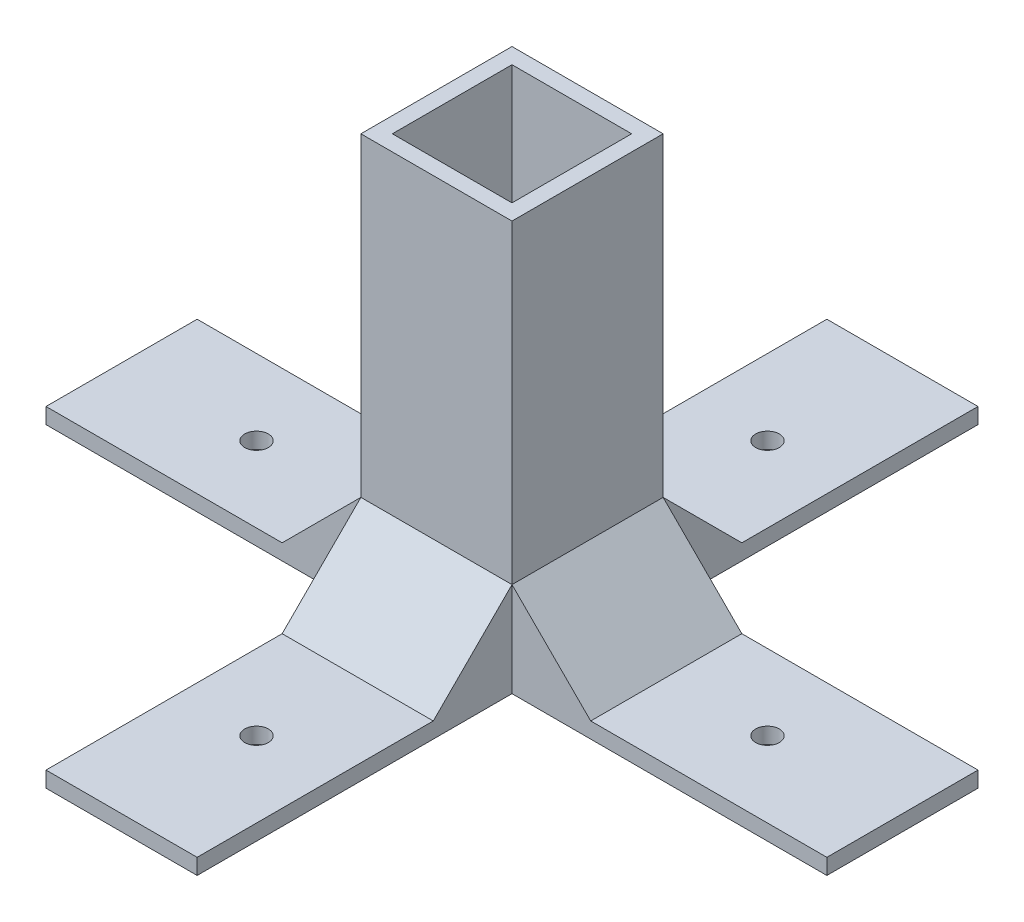
ISO-10303-21;
HEADER;
FILE_DESCRIPTION(('STEP AP214'),'2;1');
FILE_NAME('part.step','',(''),(''),'','','');
FILE_SCHEMA(('AUTOMOTIVE_DESIGN { 1 0 10303 214 1 1 1 1 }'));
ENDSEC;
DATA;
#1=APPLICATION_CONTEXT('core data for automotive mechanical design processes');
#2=APPLICATION_PROTOCOL_DEFINITION('international standard','automotive_design',2000,#1);
#3=PRODUCT_CONTEXT('',#1,'mechanical');
#4=PRODUCT('Part','Part','',(#3));
#5=PRODUCT_RELATED_PRODUCT_CATEGORY('part','',(#4));
#6=PRODUCT_DEFINITION_FORMATION('','',#4);
#7=PRODUCT_DEFINITION_CONTEXT('part definition',#1,'design');
#8=PRODUCT_DEFINITION('design','',#6,#7);
#9=PRODUCT_DEFINITION_SHAPE('','',#8);
#10=(LENGTH_UNIT() NAMED_UNIT(*) SI_UNIT(.MILLI.,.METRE.));
#11=(NAMED_UNIT(*) PLANE_ANGLE_UNIT() SI_UNIT($,.RADIAN.));
#12=(NAMED_UNIT(*) SI_UNIT($,.STERADIAN.) SOLID_ANGLE_UNIT());
#13=UNCERTAINTY_MEASURE_WITH_UNIT(LENGTH_MEASURE(1.E-05),#10,'distance_accuracy_value','');
#14=(GEOMETRIC_REPRESENTATION_CONTEXT(3) GLOBAL_UNCERTAINTY_ASSIGNED_CONTEXT((#13)) GLOBAL_UNIT_ASSIGNED_CONTEXT((#10,
#11,#12)) REPRESENTATION_CONTEXT('',''));
#15=CARTESIAN_POINT('',(0.,0.,0.));
#16=DIRECTION('',(0.,0.,1.));
#17=DIRECTION('',(1.,0.,0.));
#18=AXIS2_PLACEMENT_3D('',#15,#16,#17);
#19=CARTESIAN_POINT('',(9.6,-2.,9.6));
#20=DIRECTION('',(0.,0.,1.));
#21=DIRECTION('',(1.,0.,0.));
#22=AXIS2_PLACEMENT_3D('',#19,#20,#21);
#23=PLANE('',#22);
#24=DIRECTION('',(0.707106781186544,-0.707106781186551,0.));
#25=VECTOR('',#24,1.);
#26=CARTESIAN_POINT('',(9.60000000000002,10.,9.6));
#27=LINE('',#26,#25);
#28=CARTESIAN_POINT('',(19.6,0.,9.59999999999999));
#29=VERTEX_POINT('',#28);
#30=CARTESIAN_POINT('',(9.6,10.,9.6));
#31=VERTEX_POINT('',#30);
#32=EDGE_CURVE('E400',#29,#31,#27,.F.);
#33=ORIENTED_EDGE('',*,*,#32,.T.);
#34=DIRECTION('',(0.,1.,0.));
#35=VECTOR('',#34,1.);
#36=CARTESIAN_POINT('',(9.6,-2.,9.6));
#37=LINE('',#36,#35);
#38=CARTESIAN_POINT('',(9.6,-2.,9.6));
#39=VERTEX_POINT('',#38);
#40=EDGE_CURVE('E306',#39,#31,#37,.T.);
#41=ORIENTED_EDGE('',*,*,#40,.F.);
#42=DIRECTION('',(1.,0.,0.));
#43=VECTOR('',#42,1.);
#44=CARTESIAN_POINT('',(9.6,-2.,9.6));
#45=LINE('',#44,#43);
#46=CARTESIAN_POINT('',(49.6,-2.,9.59999999999997));
#47=VERTEX_POINT('',#46);
#48=EDGE_CURVE('E267',#39,#47,#45,.T.);
#49=ORIENTED_EDGE('',*,*,#48,.T.);
#50=DIRECTION('',(0.,1.,0.));
#51=VECTOR('',#50,1.);
#52=CARTESIAN_POINT('',(49.6,-2.,9.59999999999997));
#53=LINE('',#52,#51);
#54=CARTESIAN_POINT('',(49.6,0.,9.59999999999997));
#55=VERTEX_POINT('',#54);
#56=EDGE_CURVE('E303',#47,#55,#53,.T.);
#57=ORIENTED_EDGE('',*,*,#56,.T.);
#58=DIRECTION('',(1.,0.,0.));
#59=VECTOR('',#58,1.);
#60=CARTESIAN_POINT('',(9.6,0.,9.6));
#61=LINE('',#60,#59);
#62=EDGE_CURVE('E295',#29,#55,#61,.T.);
#63=ORIENTED_EDGE('',*,*,#62,.F.);
#64=EDGE_LOOP('',(#33,#41,#49,#57,#63));
#65=FACE_BOUND('',#64,.T.);
#66=ADVANCED_FACE('F63',(#65),#23,.T.);
#67=DIRECTION('',(0.,-1.,0.));
#68=VECTOR('',#67,1.);
#69=CARTESIAN_POINT('',(-9.6,50.,9.6));
#70=LINE('',#69,#68);
#71=CARTESIAN_POINT('',(-9.6,50.,9.6));
#72=VERTEX_POINT('',#71);
#73=CARTESIAN_POINT('',(-9.6,10.0000000000001,9.6));
#74=VERTEX_POINT('',#73);
#75=EDGE_CURVE('E364',#72,#74,#70,.T.);
#76=ORIENTED_EDGE('',*,*,#75,.T.);
#77=DIRECTION('',(1.,0.,0.));
#78=VECTOR('',#77,1.);
#79=CARTESIAN_POINT('',(9.6,10.,9.6));
#80=LINE('',#79,#78);
#81=EDGE_CURVE('E403',#74,#31,#80,.T.);
#82=ORIENTED_EDGE('',*,*,#81,.T.);
#83=DIRECTION('',(0.,-1.,0.));
#84=VECTOR('',#83,1.);
#85=CARTESIAN_POINT('',(9.6,50.,9.6));
#86=LINE('',#85,#84);
#87=CARTESIAN_POINT('',(9.6,50.,9.6));
#88=VERTEX_POINT('',#87);
#89=EDGE_CURVE('E361',#88,#31,#86,.T.);
#90=ORIENTED_EDGE('',*,*,#89,.F.);
#91=DIRECTION('',(1.,0.,0.));
#92=VECTOR('',#91,1.);
#93=CARTESIAN_POINT('',(-7.6,50.,9.6));
#94=LINE('',#93,#92);
#95=EDGE_CURVE('E359',#72,#88,#94,.T.);
#96=ORIENTED_EDGE('',*,*,#95,.F.);
#97=EDGE_LOOP('',(#76,#82,#90,#96));
#98=FACE_BOUND('',#97,.T.);
#99=ADVANCED_FACE('F409',(#98),#23,.T.);
#100=CARTESIAN_POINT('',(9.6,-2.,-9.6));
#101=DIRECTION('',(1.,0.,0.));
#102=DIRECTION('',(0.,0.,-1.));
#103=AXIS2_PLACEMENT_3D('',#100,#101,#102);
#104=PLANE('',#103);
#105=ORIENTED_EDGE('',*,*,#89,.T.);
#106=DIRECTION('',(0.,0.,-1.));
#107=VECTOR('',#106,1.);
#108=CARTESIAN_POINT('',(9.6,10.,-9.6));
#109=LINE('',#108,#107);
#110=CARTESIAN_POINT('',(9.6,10.0000000000001,-9.6));
#111=VERTEX_POINT('',#110);
#112=EDGE_CURVE('E393',#31,#111,#109,.T.);
#113=ORIENTED_EDGE('',*,*,#112,.T.);
#114=DIRECTION('',(0.,-1.,0.));
#115=VECTOR('',#114,1.);
#116=CARTESIAN_POINT('',(9.6,50.,-9.6));
#117=LINE('',#116,#115);
#118=CARTESIAN_POINT('',(9.6,50.,-9.6));
#119=VERTEX_POINT('',#118);
#120=EDGE_CURVE('E370',#119,#111,#117,.T.);
#121=ORIENTED_EDGE('',*,*,#120,.F.);
#122=DIRECTION('',(0.,0.,-1.));
#123=VECTOR('',#122,1.);
#124=CARTESIAN_POINT('',(9.6,50.,-7.6));
#125=LINE('',#124,#123);
#126=EDGE_CURVE('E352',#88,#119,#125,.T.);
#127=ORIENTED_EDGE('',*,*,#126,.F.);
#128=EDGE_LOOP('',(#105,#113,#121,#127));
#129=FACE_BOUND('',#128,.T.);
#130=ADVANCED_FACE('F416',(#129),#104,.T.);
#131=CARTESIAN_POINT('',(-9.60000000000001,-2.,-9.6));
#132=DIRECTION('',(0.,0.,-1.));
#133=DIRECTION('',(-1.,0.,0.));
#134=AXIS2_PLACEMENT_3D('',#131,#132,#133);
#135=PLANE('',#134);
#136=ORIENTED_EDGE('',*,*,#120,.T.);
#137=DIRECTION('',(-1.,0.,0.));
#138=VECTOR('',#137,1.);
#139=CARTESIAN_POINT('',(-9.6,10.0000000000001,-9.6));
#140=LINE('',#139,#138);
#141=CARTESIAN_POINT('',(-9.6,10.0000000000001,-9.6));
#142=VERTEX_POINT('',#141);
#143=EDGE_CURVE('E384',#111,#142,#140,.T.);
#144=ORIENTED_EDGE('',*,*,#143,.T.);
#145=DIRECTION('',(0.,-1.,0.));
#146=VECTOR('',#145,1.);
#147=CARTESIAN_POINT('',(-9.6,50.,-9.6));
#148=LINE('',#147,#146);
#149=CARTESIAN_POINT('',(-9.6,50.,-9.6));
#150=VERTEX_POINT('',#149);
#151=EDGE_CURVE('E367',#150,#142,#148,.T.);
#152=ORIENTED_EDGE('',*,*,#151,.F.);
#153=DIRECTION('',(-1.,0.,0.));
#154=VECTOR('',#153,1.);
#155=CARTESIAN_POINT('',(-7.6,50.,-9.6));
#156=LINE('',#155,#154);
#157=EDGE_CURVE('E355',#119,#150,#156,.T.);
#158=ORIENTED_EDGE('',*,*,#157,.F.);
#159=EDGE_LOOP('',(#136,#144,#152,#158));
#160=FACE_BOUND('',#159,.T.);
#161=ADVANCED_FACE('F472',(#160),#135,.T.);
#162=CARTESIAN_POINT('',(0.,50.,0.));
#163=DIRECTION('',(0.,1.,0.));
#164=DIRECTION('',(0.,0.,1.));
#165=AXIS2_PLACEMENT_3D('',#162,#163,#164);
#166=PLANE('',#165);
#167=ORIENTED_EDGE('',*,*,#126,.T.);
#168=ORIENTED_EDGE('',*,*,#157,.T.);
#169=DIRECTION('',(0.,0.,1.));
#170=VECTOR('',#169,1.);
#171=CARTESIAN_POINT('',(-9.6,50.,-7.6));
#172=LINE('',#171,#170);
#173=EDGE_CURVE('E357',#150,#72,#172,.T.);
#174=ORIENTED_EDGE('',*,*,#173,.T.);
#175=ORIENTED_EDGE('',*,*,#95,.T.);
#176=EDGE_LOOP('',(#167,#168,#174,#175));
#177=FACE_BOUND('',#176,.T.);
#178=DIRECTION('',(-1.,0.,0.));
#179=VECTOR('',#178,1.);
#180=CARTESIAN_POINT('',(-7.6,50.,-7.6));
#181=LINE('',#180,#179);
#182=CARTESIAN_POINT('',(7.6,50.,-7.6));
#183=VERTEX_POINT('',#182);
#184=CARTESIAN_POINT('',(-7.6,50.,-7.6));
#185=VERTEX_POINT('',#184);
#186=EDGE_CURVE('E325',#183,#185,#181,.T.);
#187=ORIENTED_EDGE('',*,*,#186,.F.);
#188=DIRECTION('',(0.,0.,-1.));
#189=VECTOR('',#188,1.);
#190=CARTESIAN_POINT('',(7.6,50.,-7.6));
#191=LINE('',#190,#189);
#192=CARTESIAN_POINT('',(7.6,50.,7.6));
#193=VERTEX_POINT('',#192);
#194=EDGE_CURVE('E323',#193,#183,#191,.T.);
#195=ORIENTED_EDGE('',*,*,#194,.F.);
#196=DIRECTION('',(1.,0.,0.));
#197=VECTOR('',#196,1.);
#198=CARTESIAN_POINT('',(-7.6,50.,7.6));
#199=LINE('',#198,#197);
#200=CARTESIAN_POINT('',(-7.6,50.,7.6));
#201=VERTEX_POINT('',#200);
#202=EDGE_CURVE('E331',#201,#193,#199,.T.);
#203=ORIENTED_EDGE('',*,*,#202,.F.);
#204=DIRECTION('',(0.,0.,1.));
#205=VECTOR('',#204,1.);
#206=CARTESIAN_POINT('',(-7.6,50.,-7.6));
#207=LINE('',#206,#205);
#208=EDGE_CURVE('E328',#185,#201,#207,.T.);
#209=ORIENTED_EDGE('',*,*,#208,.F.);
#210=EDGE_LOOP('',(#187,#195,#203,#209));
#211=FACE_BOUND('',#210,.T.);
#212=ADVANCED_FACE('F522',(#177,#211),#166,.T.);
#213=CARTESIAN_POINT('',(-9.6,50.,-7.6));
#214=DIRECTION('',(1.,0.,0.));
#215=DIRECTION('',(0.,0.,-1.));
#216=AXIS2_PLACEMENT_3D('',#213,#214,#215);
#217=PLANE('',#216);
#218=ORIENTED_EDGE('',*,*,#151,.T.);
#219=DIRECTION('',(0.,0.,1.));
#220=VECTOR('',#219,1.);
#221=CARTESIAN_POINT('',(-9.6,10.0000000000001,-7.6));
#222=LINE('',#221,#220);
#223=EDGE_CURVE('E373',#142,#74,#222,.T.);
#224=ORIENTED_EDGE('',*,*,#223,.T.);
#225=ORIENTED_EDGE('',*,*,#75,.F.);
#226=ORIENTED_EDGE('',*,*,#173,.F.);
#227=EDGE_LOOP('',(#218,#224,#225,#226));
#228=FACE_BOUND('',#227,.T.);
#229=ADVANCED_FACE('F475',(#228),#217,.F.);
#230=CARTESIAN_POINT('',(7.6,50.,-7.6));
#231=DIRECTION('',(-1.,0.,0.));
#232=DIRECTION('',(0.,0.,1.));
#233=AXIS2_PLACEMENT_3D('',#230,#231,#232);
#234=PLANE('',#233);
#235=DIRECTION('',(0.,0.,-1.));
#236=VECTOR('',#235,1.);
#237=CARTESIAN_POINT('',(7.6,0.,-7.6));
#238=LINE('',#237,#236);
#239=CARTESIAN_POINT('',(7.6,0.,7.6));
#240=VERTEX_POINT('',#239);
#241=CARTESIAN_POINT('',(7.6,0.,-7.6));
#242=VERTEX_POINT('',#241);
#243=EDGE_CURVE('E300',#240,#242,#238,.T.);
#244=ORIENTED_EDGE('',*,*,#243,.F.);
#245=DIRECTION('',(0.,-1.,0.));
#246=VECTOR('',#245,1.);
#247=CARTESIAN_POINT('',(7.6,50.,7.6));
#248=LINE('',#247,#246);
#249=EDGE_CURVE('E333',#193,#240,#248,.T.);
#250=ORIENTED_EDGE('',*,*,#249,.F.);
#251=ORIENTED_EDGE('',*,*,#194,.T.);
#252=DIRECTION('',(0.,-1.,0.));
#253=VECTOR('',#252,1.);
#254=CARTESIAN_POINT('',(7.6,50.,-7.6));
#255=LINE('',#254,#253);
#256=EDGE_CURVE('E349',#183,#242,#255,.T.);
#257=ORIENTED_EDGE('',*,*,#256,.T.);
#258=EDGE_LOOP('',(#244,#250,#251,#257));
#259=FACE_BOUND('',#258,.T.);
#260=ADVANCED_FACE('F749',(#259),#234,.T.);
#261=CARTESIAN_POINT('',(-7.6,50.,-7.6));
#262=DIRECTION('',(0.,0.,1.));
#263=DIRECTION('',(1.,0.,0.));
#264=AXIS2_PLACEMENT_3D('',#261,#262,#263);
#265=PLANE('',#264);
#266=DIRECTION('',(-1.,0.,0.));
#267=VECTOR('',#266,1.);
#268=CARTESIAN_POINT('',(-7.6,0.,-7.6));
#269=LINE('',#268,#267);
#270=CARTESIAN_POINT('',(-7.6,0.,-7.6));
#271=VERTEX_POINT('',#270);
#272=EDGE_CURVE('E336',#242,#271,#269,.T.);
#273=ORIENTED_EDGE('',*,*,#272,.F.);
#274=ORIENTED_EDGE('',*,*,#256,.F.);
#275=ORIENTED_EDGE('',*,*,#186,.T.);
#276=DIRECTION('',(0.,-1.,0.));
#277=VECTOR('',#276,1.);
#278=CARTESIAN_POINT('',(-7.6,50.,-7.6));
#279=LINE('',#278,#277);
#280=EDGE_CURVE('E347',#185,#271,#279,.T.);
#281=ORIENTED_EDGE('',*,*,#280,.T.);
#282=EDGE_LOOP('',(#273,#274,#275,#281));
#283=FACE_BOUND('',#282,.T.);
#284=ADVANCED_FACE('F793',(#283),#265,.T.);
#285=CARTESIAN_POINT('',(-7.6,50.,-7.6));
#286=DIRECTION('',(1.,0.,0.));
#287=DIRECTION('',(0.,0.,-1.));
#288=AXIS2_PLACEMENT_3D('',#285,#286,#287);
#289=PLANE('',#288);
#290=DIRECTION('',(0.,0.,1.));
#291=VECTOR('',#290,1.);
#292=CARTESIAN_POINT('',(-7.6,0.,-7.6));
#293=LINE('',#292,#291);
#294=CARTESIAN_POINT('',(-7.6,0.,7.6));
#295=VERTEX_POINT('',#294);
#296=EDGE_CURVE('E339',#271,#295,#293,.T.);
#297=ORIENTED_EDGE('',*,*,#296,.F.);
#298=ORIENTED_EDGE('',*,*,#280,.F.);
#299=ORIENTED_EDGE('',*,*,#208,.T.);
#300=DIRECTION('',(0.,-1.,0.));
#301=VECTOR('',#300,1.);
#302=CARTESIAN_POINT('',(-7.6,50.,7.6));
#303=LINE('',#302,#301);
#304=EDGE_CURVE('E345',#201,#295,#303,.T.);
#305=ORIENTED_EDGE('',*,*,#304,.T.);
#306=EDGE_LOOP('',(#297,#298,#299,#305));
#307=FACE_BOUND('',#306,.T.);
#308=ADVANCED_FACE('F784',(#307),#289,.T.);
#309=CARTESIAN_POINT('',(-7.6,50.,7.6));
#310=DIRECTION('',(0.,0.,-1.));
#311=DIRECTION('',(-1.,0.,0.));
#312=AXIS2_PLACEMENT_3D('',#309,#310,#311);
#313=PLANE('',#312);
#314=DIRECTION('',(1.,0.,0.));
#315=VECTOR('',#314,1.);
#316=CARTESIAN_POINT('',(-7.6,0.,7.6));
#317=LINE('',#316,#315);
#318=EDGE_CURVE('E326',#295,#240,#317,.T.);
#319=ORIENTED_EDGE('',*,*,#318,.F.);
#320=ORIENTED_EDGE('',*,*,#304,.F.);
#321=ORIENTED_EDGE('',*,*,#202,.T.);
#322=ORIENTED_EDGE('',*,*,#249,.T.);
#323=EDGE_LOOP('',(#319,#320,#321,#322));
#324=FACE_BOUND('',#323,.T.);
#325=ADVANCED_FACE('F775',(#324),#313,.T.);
#326=CARTESIAN_POINT('',(0.,0.,0.));
#327=DIRECTION('',(0.,1.,0.));
#328=DIRECTION('',(0.,0.,1.));
#329=AXIS2_PLACEMENT_3D('',#326,#327,#328);
#330=PLANE('',#329);
#331=ORIENTED_EDGE('',*,*,#318,.T.);
#332=ORIENTED_EDGE('',*,*,#243,.T.);
#333=ORIENTED_EDGE('',*,*,#272,.T.);
#334=ORIENTED_EDGE('',*,*,#296,.T.);
#335=EDGE_LOOP('',(#331,#332,#333,#334));
#336=FACE_BOUND('',#335,.T.);
#337=ADVANCED_FACE('F490',(#336),#330,.T.);
#338=CARTESIAN_POINT('',(32.4553859392813,0.,-9.18462910167283E-13));
#339=DIRECTION('',(0.,1.,0.));
#340=DIRECTION('',(0.,0.,1.));
#341=AXIS2_PLACEMENT_3D('',#338,#339,#340);
#342=CIRCLE('',#341,1.50000000000072);
#343=CARTESIAN_POINT('',(32.4553859392813,0.,1.4999999999998));
#344=VERTEX_POINT('',#343);
#345=EDGE_CURVE('E672',#344,#344,#342,.T.);
#346=ORIENTED_EDGE('',*,*,#345,.F.);
#347=EDGE_LOOP('',(#346));
#348=FACE_BOUND('',#347,.T.);
#349=DIRECTION('',(-1.,0.,0.));
#350=VECTOR('',#349,1.);
#351=CARTESIAN_POINT('',(9.6,0.,-9.6));
#352=LINE('',#351,#350);
#353=CARTESIAN_POINT('',(49.6,0.,-9.6));
#354=VERTEX_POINT('',#353);
#355=CARTESIAN_POINT('',(19.5999999999999,0.,-9.6));
#356=VERTEX_POINT('',#355);
#357=EDGE_CURVE('E239',#354,#356,#352,.T.);
#358=ORIENTED_EDGE('',*,*,#357,.T.);
#359=DIRECTION('',(0.,0.,1.));
#360=VECTOR('',#359,1.);
#361=CARTESIAN_POINT('',(19.6,0.,9.59999999999999));
#362=LINE('',#361,#360);
#363=EDGE_CURVE('E396',#356,#29,#362,.T.);
#364=ORIENTED_EDGE('',*,*,#363,.T.);
#365=ORIENTED_EDGE('',*,*,#62,.T.);
#366=DIRECTION('',(0.,0.,-1.));
#367=VECTOR('',#366,1.);
#368=CARTESIAN_POINT('',(49.6,0.,9.59999999999997));
#369=LINE('',#368,#367);
#370=EDGE_CURVE('E242',#55,#354,#369,.T.);
#371=ORIENTED_EDGE('',*,*,#370,.T.);
#372=EDGE_LOOP('',(#358,#364,#365,#371));
#373=FACE_BOUND('',#372,.T.);
#374=ADVANCED_FACE('F431',(#348,#373),#330,.T.);
#375=CARTESIAN_POINT('',(1.8343237351206E-12,0.,32.4553859392804));
#376=DIRECTION('',(0.,1.,0.));
#377=DIRECTION('',(0.,0.,1.));
#378=AXIS2_PLACEMENT_3D('',#375,#376,#377);
#379=CIRCLE('',#378,1.50000000000197);
#380=CARTESIAN_POINT('',(1.8343237351206E-12,0.,33.9553859392823));
#381=VERTEX_POINT('',#380);
#382=EDGE_CURVE('E680',#381,#381,#379,.T.);
#383=ORIENTED_EDGE('',*,*,#382,.F.);
#384=EDGE_LOOP('',(#383));
#385=FACE_BOUND('',#384,.T.);
#386=DIRECTION('',(0.,0.,-1.));
#387=VECTOR('',#386,1.);
#388=CARTESIAN_POINT('',(9.6,0.,9.6));
#389=LINE('',#388,#387);
#390=CARTESIAN_POINT('',(9.6,0.,49.6));
#391=VERTEX_POINT('',#390);
#392=CARTESIAN_POINT('',(9.6,0.,19.5999999999999));
#393=VERTEX_POINT('',#392);
#394=EDGE_CURVE('E293',#391,#393,#389,.T.);
#395=ORIENTED_EDGE('',*,*,#394,.T.);
#396=DIRECTION('',(-1.,0.,0.));
#397=VECTOR('',#396,1.);
#398=CARTESIAN_POINT('',(-9.59999999999999,0.,19.6));
#399=LINE('',#398,#397);
#400=CARTESIAN_POINT('',(-9.59999999999999,0.,19.6));
#401=VERTEX_POINT('',#400);
#402=EDGE_CURVE('E84',#393,#401,#399,.T.);
#403=ORIENTED_EDGE('',*,*,#402,.T.);
#404=DIRECTION('',(0.,0.,1.));
#405=VECTOR('',#404,1.);
#406=CARTESIAN_POINT('',(-9.6,0.,9.60000000000001));
#407=LINE('',#406,#405);
#408=CARTESIAN_POINT('',(-9.59999999999997,0.,49.6));
#409=VERTEX_POINT('',#408);
#410=EDGE_CURVE('E288',#401,#409,#407,.T.);
#411=ORIENTED_EDGE('',*,*,#410,.T.);
#412=DIRECTION('',(1.,0.,0.));
#413=VECTOR('',#412,1.);
#414=CARTESIAN_POINT('',(-9.59999999999997,0.,49.6));
#415=LINE('',#414,#413);
#416=EDGE_CURVE('E290',#409,#391,#415,.T.);
#417=ORIENTED_EDGE('',*,*,#416,.T.);
#418=EDGE_LOOP('',(#395,#403,#411,#417));
#419=FACE_BOUND('',#418,.T.);
#420=ADVANCED_FACE('F482',(#385,#419),#330,.T.);
#421=CARTESIAN_POINT('',(-32.4553859392794,0.,9.22437548617846E-13));
#422=DIRECTION('',(0.,1.,0.));
#423=DIRECTION('',(0.,0.,1.));
#424=AXIS2_PLACEMENT_3D('',#421,#422,#423);
#425=CIRCLE('',#424,1.50000000000147);
#426=CARTESIAN_POINT('',(-32.4553859392794,0.,1.5000000000024));
#427=VERTEX_POINT('',#426);
#428=EDGE_CURVE('E245',#427,#427,#425,.T.);
#429=ORIENTED_EDGE('',*,*,#428,.F.);
#430=EDGE_LOOP('',(#429));
#431=FACE_BOUND('',#430,.T.);
#432=DIRECTION('',(1.,0.,0.));
#433=VECTOR('',#432,1.);
#434=CARTESIAN_POINT('',(-9.6,0.,9.60000000000001));
#435=LINE('',#434,#433);
#436=CARTESIAN_POINT('',(-49.6,0.,9.60000000000001));
#437=VERTEX_POINT('',#436);
#438=CARTESIAN_POINT('',(-19.6,0.,9.60000000000001));
#439=VERTEX_POINT('',#438);
#440=EDGE_CURVE('E286',#437,#439,#435,.T.);
#441=ORIENTED_EDGE('',*,*,#440,.T.);
#442=DIRECTION('',(0.,0.,-1.));
#443=VECTOR('',#442,1.);
#444=CARTESIAN_POINT('',(-19.6,0.,0.));
#445=LINE('',#444,#443);
#446=CARTESIAN_POINT('',(-19.6,0.,-9.6));
#447=VERTEX_POINT('',#446);
#448=EDGE_CURVE('E376',#439,#447,#445,.T.);
#449=ORIENTED_EDGE('',*,*,#448,.T.);
#450=DIRECTION('',(-1.,0.,0.));
#451=VECTOR('',#450,1.);
#452=CARTESIAN_POINT('',(-9.60000000000001,0.,-9.6));
#453=LINE('',#452,#451);
#454=CARTESIAN_POINT('',(-49.6,0.,-9.6));
#455=VERTEX_POINT('',#454);
#456=EDGE_CURVE('E281',#447,#455,#453,.T.);
#457=ORIENTED_EDGE('',*,*,#456,.T.);
#458=DIRECTION('',(0.,0.,1.));
#459=VECTOR('',#458,1.);
#460=CARTESIAN_POINT('',(-49.6,0.,-9.6));
#461=LINE('',#460,#459);
#462=EDGE_CURVE('E283',#455,#437,#461,.T.);
#463=ORIENTED_EDGE('',*,*,#462,.T.);
#464=EDGE_LOOP('',(#441,#449,#457,#463));
#465=FACE_BOUND('',#464,.T.);
#466=ADVANCED_FACE('F480',(#431,#465),#330,.T.);
#467=CARTESIAN_POINT('',(0.,0.,-32.4553859392804));
#468=DIRECTION('',(0.,1.,0.));
#469=DIRECTION('',(0.,0.,1.));
#470=AXIS2_PLACEMENT_3D('',#467,#468,#469);
#471=CIRCLE('',#470,1.5);
#472=CARTESIAN_POINT('',(0.,0.,-30.9553859392804));
#473=VERTEX_POINT('',#472);
#474=EDGE_CURVE('E667',#473,#473,#471,.T.);
#475=ORIENTED_EDGE('',*,*,#474,.F.);
#476=EDGE_LOOP('',(#475));
#477=FACE_BOUND('',#476,.T.);
#478=DIRECTION('',(0.,0.,1.));
#479=VECTOR('',#478,1.);
#480=CARTESIAN_POINT('',(-9.60000000000001,0.,-9.6));
#481=LINE('',#480,#479);
#482=CARTESIAN_POINT('',(-9.60000000000002,0.,-49.6));
#483=VERTEX_POINT('',#482);
#484=CARTESIAN_POINT('',(-9.60000000000001,0.,-19.6));
#485=VERTEX_POINT('',#484);
#486=EDGE_CURVE('E278',#483,#485,#481,.T.);
#487=ORIENTED_EDGE('',*,*,#486,.T.);
#488=DIRECTION('',(1.,0.,0.));
#489=VECTOR('',#488,1.);
#490=CARTESIAN_POINT('',(9.6,0.,-19.6));
#491=LINE('',#490,#489);
#492=CARTESIAN_POINT('',(9.59999999999999,0.,-19.6));
#493=VERTEX_POINT('',#492);
#494=EDGE_CURVE('E387',#485,#493,#491,.T.);
#495=ORIENTED_EDGE('',*,*,#494,.T.);
#496=DIRECTION('',(0.,0.,-1.));
#497=VECTOR('',#496,1.);
#498=CARTESIAN_POINT('',(9.6,0.,-9.6));
#499=LINE('',#498,#497);
#500=CARTESIAN_POINT('',(9.59999999999996,0.,-49.6));
#501=VERTEX_POINT('',#500);
#502=EDGE_CURVE('E274',#493,#501,#499,.T.);
#503=ORIENTED_EDGE('',*,*,#502,.T.);
#504=DIRECTION('',(-1.,0.,0.));
#505=VECTOR('',#504,1.);
#506=CARTESIAN_POINT('',(9.59999999999996,0.,-49.6));
#507=LINE('',#506,#505);
#508=EDGE_CURVE('E218',#501,#483,#507,.T.);
#509=ORIENTED_EDGE('',*,*,#508,.T.);
#510=EDGE_LOOP('',(#487,#495,#503,#509));
#511=FACE_BOUND('',#510,.T.);
#512=ADVANCED_FACE('F465',(#477,#511),#330,.T.);
#513=DIRECTION('',(0.,-0.707106781186551,-0.707106781186544));
#514=VECTOR('',#513,1.);
#515=CARTESIAN_POINT('',(9.6,10.0000000000001,-9.60000000000001));
#516=LINE('',#515,#514);
#517=EDGE_CURVE('E391',#493,#111,#516,.F.);
#518=ORIENTED_EDGE('',*,*,#517,.T.);
#519=DIRECTION('',(0.,1.,0.));
#520=VECTOR('',#519,1.);
#521=CARTESIAN_POINT('',(9.6,-2.,-9.6));
#522=LINE('',#521,#520);
#523=CARTESIAN_POINT('',(9.6,-2.,-9.6));
#524=VERTEX_POINT('',#523);
#525=EDGE_CURVE('E238',#524,#111,#522,.T.);
#526=ORIENTED_EDGE('',*,*,#525,.F.);
#527=DIRECTION('',(0.,0.,-1.));
#528=VECTOR('',#527,1.);
#529=CARTESIAN_POINT('',(9.6,-2.,-9.6));
#530=LINE('',#529,#528);
#531=CARTESIAN_POINT('',(9.59999999999996,-2.,-49.6));
#532=VERTEX_POINT('',#531);
#533=EDGE_CURVE('E230',#524,#532,#530,.T.);
#534=ORIENTED_EDGE('',*,*,#533,.T.);
#535=DIRECTION('',(0.,1.,0.));
#536=VECTOR('',#535,1.);
#537=CARTESIAN_POINT('',(9.59999999999996,-2.,-49.6));
#538=LINE('',#537,#536);
#539=EDGE_CURVE('E213',#532,#501,#538,.T.);
#540=ORIENTED_EDGE('',*,*,#539,.T.);
#541=ORIENTED_EDGE('',*,*,#502,.F.);
#542=EDGE_LOOP('',(#518,#526,#534,#540,#541));
#543=FACE_BOUND('',#542,.T.);
#544=ADVANCED_FACE('F237',(#543),#104,.T.);
#545=CARTESIAN_POINT('',(9.6,-2.,-9.6));
#546=DIRECTION('',(0.,0.,-1.));
#547=DIRECTION('',(-1.,0.,0.));
#548=AXIS2_PLACEMENT_3D('',#545,#546,#547);
#549=PLANE('',#548);
#550=ORIENTED_EDGE('',*,*,#357,.F.);
#551=DIRECTION('',(0.,1.,0.));
#552=VECTOR('',#551,1.);
#553=CARTESIAN_POINT('',(49.6,-2.,-9.6));
#554=LINE('',#553,#552);
#555=CARTESIAN_POINT('',(49.6,-2.,-9.6));
#556=VERTEX_POINT('',#555);
#557=EDGE_CURVE('E301',#556,#354,#554,.T.);
#558=ORIENTED_EDGE('',*,*,#557,.F.);
#559=DIRECTION('',(-1.,0.,0.));
#560=VECTOR('',#559,1.);
#561=CARTESIAN_POINT('',(9.6,-2.,-9.6));
#562=LINE('',#561,#560);
#563=EDGE_CURVE('E223',#556,#524,#562,.T.);
#564=ORIENTED_EDGE('',*,*,#563,.T.);
#565=ORIENTED_EDGE('',*,*,#525,.T.);
#566=DIRECTION('',(-0.707106781186544,0.707106781186551,0.));
#567=VECTOR('',#566,1.);
#568=CARTESIAN_POINT('',(9.6,10.,-9.6));
#569=LINE('',#568,#567);
#570=EDGE_CURVE('E398',#111,#356,#569,.F.);
#571=ORIENTED_EDGE('',*,*,#570,.T.);
#572=EDGE_LOOP('',(#550,#558,#564,#565,#571));
#573=FACE_BOUND('',#572,.T.);
#574=ADVANCED_FACE('F429',(#573),#549,.T.);
#575=CARTESIAN_POINT('',(49.6,-2.,9.59999999999997));
#576=DIRECTION('',(1.,0.,0.));
#577=DIRECTION('',(0.,0.,-1.));
#578=AXIS2_PLACEMENT_3D('',#575,#576,#577);
#579=PLANE('',#578);
#580=ORIENTED_EDGE('',*,*,#370,.F.);
#581=ORIENTED_EDGE('',*,*,#56,.F.);
#582=DIRECTION('',(0.,0.,-1.));
#583=VECTOR('',#582,1.);
#584=CARTESIAN_POINT('',(49.6,-2.,9.59999999999997));
#585=LINE('',#584,#583);
#586=EDGE_CURVE('E270',#47,#556,#585,.T.);
#587=ORIENTED_EDGE('',*,*,#586,.T.);
#588=ORIENTED_EDGE('',*,*,#557,.T.);
#589=EDGE_LOOP('',(#580,#581,#587,#588));
#590=FACE_BOUND('',#589,.T.);
#591=ADVANCED_FACE('F434',(#590),#579,.T.);
#592=DIRECTION('',(0.,1.,0.));
#593=VECTOR('',#592,1.);
#594=CARTESIAN_POINT('',(-9.6,-2.,9.60000000000001));
#595=LINE('',#594,#593);
#596=CARTESIAN_POINT('',(-9.6,-2.,9.60000000000001));
#597=VERTEX_POINT('',#596);
#598=EDGE_CURVE('E313',#597,#74,#595,.T.);
#599=ORIENTED_EDGE('',*,*,#598,.T.);
#600=DIRECTION('',(-0.707106781186544,-0.707106781186551,0.));
#601=VECTOR('',#600,1.);
#602=CARTESIAN_POINT('',(11.4,31.0000000000003,9.6));
#603=LINE('',#602,#601);
#604=EDGE_CURVE('E378',#74,#439,#603,.T.);
#605=ORIENTED_EDGE('',*,*,#604,.T.);
#606=ORIENTED_EDGE('',*,*,#440,.F.);
#607=DIRECTION('',(0.,1.,0.));
#608=VECTOR('',#607,1.);
#609=CARTESIAN_POINT('',(-49.6,-2.,9.60000000000001));
#610=LINE('',#609,#608);
#611=CARTESIAN_POINT('',(-49.6,-2.,9.60000000000001));
#612=VERTEX_POINT('',#611);
#613=EDGE_CURVE('E315',#612,#437,#610,.T.);
#614=ORIENTED_EDGE('',*,*,#613,.F.);
#615=DIRECTION('',(1.,0.,0.));
#616=VECTOR('',#615,1.);
#617=CARTESIAN_POINT('',(-9.6,-2.,9.60000000000001));
#618=LINE('',#617,#616);
#619=EDGE_CURVE('E255',#612,#597,#618,.T.);
#620=ORIENTED_EDGE('',*,*,#619,.T.);
#621=EDGE_LOOP('',(#599,#605,#606,#614,#620));
#622=FACE_BOUND('',#621,.T.);
#623=ADVANCED_FACE('F448',(#622),#23,.T.);
#624=CARTESIAN_POINT('',(9.6,-2.,9.6));
#625=DIRECTION('',(1.,0.,0.));
#626=DIRECTION('',(0.,0.,-1.));
#627=AXIS2_PLACEMENT_3D('',#624,#625,#626);
#628=PLANE('',#627);
#629=ORIENTED_EDGE('',*,*,#394,.F.);
#630=DIRECTION('',(0.,1.,0.));
#631=VECTOR('',#630,1.);
#632=CARTESIAN_POINT('',(9.6,-2.,49.6));
#633=LINE('',#632,#631);
#634=CARTESIAN_POINT('',(9.6,-2.,49.6));
#635=VERTEX_POINT('',#634);
#636=EDGE_CURVE('E308',#635,#391,#633,.T.);
#637=ORIENTED_EDGE('',*,*,#636,.F.);
#638=DIRECTION('',(0.,0.,-1.));
#639=VECTOR('',#638,1.);
#640=CARTESIAN_POINT('',(9.6,-2.,9.6));
#641=LINE('',#640,#639);
#642=EDGE_CURVE('E264',#635,#39,#641,.T.);
#643=ORIENTED_EDGE('',*,*,#642,.T.);
#644=ORIENTED_EDGE('',*,*,#40,.T.);
#645=DIRECTION('',(0.,0.707106781186551,-0.707106781186544));
#646=VECTOR('',#645,1.);
#647=CARTESIAN_POINT('',(9.6,10.,9.6));
#648=LINE('',#647,#646);
#649=EDGE_CURVE('E71',#31,#393,#648,.F.);
#650=ORIENTED_EDGE('',*,*,#649,.T.);
#651=EDGE_LOOP('',(#629,#637,#643,#644,#650));
#652=FACE_BOUND('',#651,.T.);
#653=ADVANCED_FACE('F438',(#652),#628,.T.);
#654=CARTESIAN_POINT('',(-9.59999999999997,-2.,49.6));
#655=DIRECTION('',(0.,0.,1.));
#656=DIRECTION('',(1.,0.,0.));
#657=AXIS2_PLACEMENT_3D('',#654,#655,#656);
#658=PLANE('',#657);
#659=ORIENTED_EDGE('',*,*,#416,.F.);
#660=DIRECTION('',(0.,1.,0.));
#661=VECTOR('',#660,1.);
#662=CARTESIAN_POINT('',(-9.59999999999997,-2.,49.6));
#663=LINE('',#662,#661);
#664=CARTESIAN_POINT('',(-9.59999999999997,-2.,49.6));
#665=VERTEX_POINT('',#664);
#666=EDGE_CURVE('E310',#665,#409,#663,.T.);
#667=ORIENTED_EDGE('',*,*,#666,.F.);
#668=DIRECTION('',(1.,0.,0.));
#669=VECTOR('',#668,1.);
#670=CARTESIAN_POINT('',(-9.59999999999997,-2.,49.6));
#671=LINE('',#670,#669);
#672=EDGE_CURVE('E261',#665,#635,#671,.T.);
#673=ORIENTED_EDGE('',*,*,#672,.T.);
#674=ORIENTED_EDGE('',*,*,#636,.T.);
#675=EDGE_LOOP('',(#659,#667,#673,#674));
#676=FACE_BOUND('',#675,.T.);
#677=ADVANCED_FACE('F441',(#676),#658,.T.);
#678=CARTESIAN_POINT('',(-9.6,-2.,9.60000000000001));
#679=DIRECTION('',(-1.,0.,0.));
#680=DIRECTION('',(0.,0.,1.));
#681=AXIS2_PLACEMENT_3D('',#678,#679,#680);
#682=PLANE('',#681);
#683=ORIENTED_EDGE('',*,*,#410,.F.);
#684=DIRECTION('',(0.,-0.707106781186551,0.707106781186544));
#685=VECTOR('',#684,1.);
#686=CARTESIAN_POINT('',(-9.6,10.,9.60000000000002));
#687=LINE('',#686,#685);
#688=EDGE_CURVE('E12',#401,#74,#687,.F.);
#689=ORIENTED_EDGE('',*,*,#688,.T.);
#690=ORIENTED_EDGE('',*,*,#598,.F.);
#691=DIRECTION('',(0.,0.,1.));
#692=VECTOR('',#691,1.);
#693=CARTESIAN_POINT('',(-9.6,-2.,9.60000000000001));
#694=LINE('',#693,#692);
#695=EDGE_CURVE('E258',#597,#665,#694,.T.);
#696=ORIENTED_EDGE('',*,*,#695,.T.);
#697=ORIENTED_EDGE('',*,*,#666,.T.);
#698=EDGE_LOOP('',(#683,#689,#690,#696,#697));
#699=FACE_BOUND('',#698,.T.);
#700=ADVANCED_FACE('F445',(#699),#682,.T.);
#701=CARTESIAN_POINT('',(-49.6,-2.,-9.6));
#702=DIRECTION('',(-1.,0.,0.));
#703=DIRECTION('',(0.,0.,1.));
#704=AXIS2_PLACEMENT_3D('',#701,#702,#703);
#705=PLANE('',#704);
#706=ORIENTED_EDGE('',*,*,#462,.F.);
#707=DIRECTION('',(0.,1.,0.));
#708=VECTOR('',#707,1.);
#709=CARTESIAN_POINT('',(-49.6,-2.,-9.6));
#710=LINE('',#709,#708);
#711=CARTESIAN_POINT('',(-49.6,-2.,-9.6));
#712=VERTEX_POINT('',#711);
#713=EDGE_CURVE('E317',#712,#455,#710,.T.);
#714=ORIENTED_EDGE('',*,*,#713,.F.);
#715=DIRECTION('',(0.,0.,1.));
#716=VECTOR('',#715,1.);
#717=CARTESIAN_POINT('',(-49.6,-2.,-9.6));
#718=LINE('',#717,#716);
#719=EDGE_CURVE('E252',#712,#612,#718,.T.);
#720=ORIENTED_EDGE('',*,*,#719,.T.);
#721=ORIENTED_EDGE('',*,*,#613,.T.);
#722=EDGE_LOOP('',(#706,#714,#720,#721));
#723=FACE_BOUND('',#722,.T.);
#724=ADVANCED_FACE('F454',(#723),#705,.T.);
#725=DIRECTION('',(0.707106781186544,0.707106781186551,0.));
#726=VECTOR('',#725,1.);
#727=CARTESIAN_POINT('',(-9.6,10.0000000000001,-9.6));
#728=LINE('',#727,#726);
#729=EDGE_CURVE('E381',#447,#142,#728,.T.);
#730=ORIENTED_EDGE('',*,*,#729,.T.);
#731=DIRECTION('',(0.,1.,0.));
#732=VECTOR('',#731,1.);
#733=CARTESIAN_POINT('',(-9.60000000000001,-2.,-9.6));
#734=LINE('',#733,#732);
#735=CARTESIAN_POINT('',(-9.60000000000001,-2.,-9.6));
#736=VERTEX_POINT('',#735);
#737=EDGE_CURVE('E320',#736,#142,#734,.T.);
#738=ORIENTED_EDGE('',*,*,#737,.F.);
#739=DIRECTION('',(-1.,0.,0.));
#740=VECTOR('',#739,1.);
#741=CARTESIAN_POINT('',(-9.60000000000001,-2.,-9.6));
#742=LINE('',#741,#740);
#743=EDGE_CURVE('E249',#736,#712,#742,.T.);
#744=ORIENTED_EDGE('',*,*,#743,.T.);
#745=ORIENTED_EDGE('',*,*,#713,.T.);
#746=ORIENTED_EDGE('',*,*,#456,.F.);
#747=EDGE_LOOP('',(#730,#738,#744,#745,#746));
#748=FACE_BOUND('',#747,.T.);
#749=ADVANCED_FACE('F457',(#748),#135,.T.);
#750=CARTESIAN_POINT('',(-9.60000000000001,-2.,-9.6));
#751=DIRECTION('',(-1.,0.,0.));
#752=DIRECTION('',(0.,0.,1.));
#753=AXIS2_PLACEMENT_3D('',#750,#751,#752);
#754=PLANE('',#753);
#755=ORIENTED_EDGE('',*,*,#486,.F.);
#756=DIRECTION('',(0.,1.,0.));
#757=VECTOR('',#756,1.);
#758=CARTESIAN_POINT('',(-9.60000000000002,-2.,-49.6));
#759=LINE('',#758,#757);
#760=CARTESIAN_POINT('',(-9.60000000000002,-2.,-49.6));
#761=VERTEX_POINT('',#760);
#762=EDGE_CURVE('E222',#761,#483,#759,.T.);
#763=ORIENTED_EDGE('',*,*,#762,.F.);
#764=DIRECTION('',(0.,0.,1.));
#765=VECTOR('',#764,1.);
#766=CARTESIAN_POINT('',(-9.60000000000001,-2.,-9.6));
#767=LINE('',#766,#765);
#768=EDGE_CURVE('E234',#761,#736,#767,.T.);
#769=ORIENTED_EDGE('',*,*,#768,.T.);
#770=ORIENTED_EDGE('',*,*,#737,.T.);
#771=DIRECTION('',(0.,0.707106781186551,0.707106781186544));
#772=VECTOR('',#771,1.);
#773=CARTESIAN_POINT('',(-9.60000000000001,10.0000000000001,-9.6));
#774=LINE('',#773,#772);
#775=EDGE_CURVE('E389',#142,#485,#774,.F.);
#776=ORIENTED_EDGE('',*,*,#775,.T.);
#777=EDGE_LOOP('',(#755,#763,#769,#770,#776));
#778=FACE_BOUND('',#777,.T.);
#779=ADVANCED_FACE('F461',(#778),#754,.T.);
#780=CARTESIAN_POINT('',(9.59999999999996,-2.,-49.6));
#781=DIRECTION('',(0.,0.,-1.));
#782=DIRECTION('',(-1.,0.,0.));
#783=AXIS2_PLACEMENT_3D('',#780,#781,#782);
#784=PLANE('',#783);
#785=ORIENTED_EDGE('',*,*,#508,.F.);
#786=ORIENTED_EDGE('',*,*,#539,.F.);
#787=DIRECTION('',(-1.,0.,0.));
#788=VECTOR('',#787,1.);
#789=CARTESIAN_POINT('',(9.59999999999996,-2.,-49.6));
#790=LINE('',#789,#788);
#791=EDGE_CURVE('E216',#532,#761,#790,.T.);
#792=ORIENTED_EDGE('',*,*,#791,.T.);
#793=ORIENTED_EDGE('',*,*,#762,.T.);
#794=EDGE_LOOP('',(#785,#786,#792,#793));
#795=FACE_BOUND('',#794,.T.);
#796=ADVANCED_FACE('F215',(#795),#784,.T.);
#797=CARTESIAN_POINT('',(0.,-2.,0.));
#798=DIRECTION('',(0.,1.,0.));
#799=DIRECTION('',(0.,0.,1.));
#800=AXIS2_PLACEMENT_3D('',#797,#798,#799);
#801=PLANE('',#800);
#802=CARTESIAN_POINT('',(0.,-2.,-32.4553859392804));
#803=DIRECTION('',(0.,1.,0.));
#804=DIRECTION('',(0.,0.,1.));
#805=AXIS2_PLACEMENT_3D('',#802,#803,#804);
#806=CIRCLE('',#805,1.5);
#807=CARTESIAN_POINT('',(0.,-2.,-30.9553859392804));
#808=VERTEX_POINT('',#807);
#809=EDGE_CURVE('E276',#808,#808,#806,.T.);
#810=ORIENTED_EDGE('',*,*,#809,.T.);
#811=EDGE_LOOP('',(#810));
#812=FACE_BOUND('',#811,.T.);
#813=CARTESIAN_POINT('',(32.4553859392813,-2.,-9.18462910167283E-13));
#814=DIRECTION('',(0.,1.,0.));
#815=DIRECTION('',(0.,0.,1.));
#816=AXIS2_PLACEMENT_3D('',#813,#814,#815);
#817=CIRCLE('',#816,1.50000000000072);
#818=CARTESIAN_POINT('',(32.4553859392813,-2.,1.4999999999998));
#819=VERTEX_POINT('',#818);
#820=EDGE_CURVE('E668',#819,#819,#817,.T.);
#821=ORIENTED_EDGE('',*,*,#820,.T.);
#822=EDGE_LOOP('',(#821));
#823=FACE_BOUND('',#822,.T.);
#824=CARTESIAN_POINT('',(1.8343237351206E-12,-2.,32.4553859392804));
#825=DIRECTION('',(0.,1.,0.));
#826=DIRECTION('',(0.,0.,1.));
#827=AXIS2_PLACEMENT_3D('',#824,#825,#826);
#828=CIRCLE('',#827,1.50000000000197);
#829=CARTESIAN_POINT('',(1.8343237351206E-12,-2.,33.9553859392823));
#830=VERTEX_POINT('',#829);
#831=EDGE_CURVE('E677',#830,#830,#828,.T.);
#832=ORIENTED_EDGE('',*,*,#831,.T.);
#833=EDGE_LOOP('',(#832));
#834=FACE_BOUND('',#833,.T.);
#835=CARTESIAN_POINT('',(-32.4553859392794,-2.,9.22437548617846E-13));
#836=DIRECTION('',(0.,1.,0.));
#837=DIRECTION('',(0.,0.,1.));
#838=AXIS2_PLACEMENT_3D('',#835,#836,#837);
#839=CIRCLE('',#838,1.50000000000147);
#840=CARTESIAN_POINT('',(-32.4553859392794,-2.,1.5000000000024));
#841=VERTEX_POINT('',#840);
#842=EDGE_CURVE('E682',#841,#841,#839,.T.);
#843=ORIENTED_EDGE('',*,*,#842,.T.);
#844=EDGE_LOOP('',(#843));
#845=FACE_BOUND('',#844,.T.);
#846=ORIENTED_EDGE('',*,*,#533,.F.);
#847=ORIENTED_EDGE('',*,*,#563,.F.);
#848=ORIENTED_EDGE('',*,*,#586,.F.);
#849=ORIENTED_EDGE('',*,*,#48,.F.);
#850=ORIENTED_EDGE('',*,*,#642,.F.);
#851=ORIENTED_EDGE('',*,*,#672,.F.);
#852=ORIENTED_EDGE('',*,*,#695,.F.);
#853=ORIENTED_EDGE('',*,*,#619,.F.);
#854=ORIENTED_EDGE('',*,*,#719,.F.);
#855=ORIENTED_EDGE('',*,*,#743,.F.);
#856=ORIENTED_EDGE('',*,*,#768,.F.);
#857=ORIENTED_EDGE('',*,*,#791,.F.);
#858=EDGE_LOOP('',(#846,#847,#848,#849,#850,#851,#852,#853,#854,#855,#856,#857));
#859=FACE_BOUND('',#858,.T.);
#860=ADVANCED_FACE('F228',(#812,#823,#834,#845,#859),#801,.F.);
#861=CARTESIAN_POINT('',(-9.6,10.0000000000001,-7.6));
#862=DIRECTION('',(0.707106781186551,-0.707106781186544,0.));
#863=DIRECTION('',(0.,0.,1.));
#864=AXIS2_PLACEMENT_3D('',#861,#862,#863);
#865=PLANE('',#864);
#866=ORIENTED_EDGE('',*,*,#729,.F.);
#867=ORIENTED_EDGE('',*,*,#448,.F.);
#868=ORIENTED_EDGE('',*,*,#604,.F.);
#869=ORIENTED_EDGE('',*,*,#223,.F.);
#870=EDGE_LOOP('',(#866,#867,#868,#869));
#871=FACE_BOUND('',#870,.T.);
#872=ADVANCED_FACE('F478',(#871),#865,.F.);
#873=CARTESIAN_POINT('',(-9.60000000000001,10.0000000000001,-9.6));
#874=DIRECTION('',(0.,0.707106781186544,-0.707106781186551));
#875=DIRECTION('',(1.,0.,0.));
#876=AXIS2_PLACEMENT_3D('',#873,#874,#875);
#877=PLANE('',#876);
#878=ORIENTED_EDGE('',*,*,#517,.F.);
#879=ORIENTED_EDGE('',*,*,#494,.F.);
#880=ORIENTED_EDGE('',*,*,#775,.F.);
#881=ORIENTED_EDGE('',*,*,#143,.F.);
#882=EDGE_LOOP('',(#878,#879,#880,#881));
#883=FACE_BOUND('',#882,.T.);
#884=ADVANCED_FACE('F469',(#883),#877,.T.);
#885=CARTESIAN_POINT('',(9.6,10.,-9.6));
#886=DIRECTION('',(0.707106781186551,0.707106781186544,0.));
#887=DIRECTION('',(0.,0.,1.));
#888=AXIS2_PLACEMENT_3D('',#885,#886,#887);
#889=PLANE('',#888);
#890=ORIENTED_EDGE('',*,*,#32,.F.);
#891=ORIENTED_EDGE('',*,*,#363,.F.);
#892=ORIENTED_EDGE('',*,*,#570,.F.);
#893=ORIENTED_EDGE('',*,*,#112,.F.);
#894=EDGE_LOOP('',(#890,#891,#892,#893));
#895=FACE_BOUND('',#894,.T.);
#896=ADVANCED_FACE('F426',(#895),#889,.T.);
#897=CARTESIAN_POINT('',(9.6,10.,9.6));
#898=DIRECTION('',(0.,0.707106781186544,0.707106781186551));
#899=DIRECTION('',(-1.,0.,0.));
#900=AXIS2_PLACEMENT_3D('',#897,#898,#899);
#901=PLANE('',#900);
#902=ORIENTED_EDGE('',*,*,#688,.F.);
#903=ORIENTED_EDGE('',*,*,#402,.F.);
#904=ORIENTED_EDGE('',*,*,#649,.F.);
#905=ORIENTED_EDGE('',*,*,#81,.F.);
#906=EDGE_LOOP('',(#902,#903,#904,#905));
#907=FACE_BOUND('',#906,.T.);
#908=ADVANCED_FACE('F65',(#907),#901,.T.);
#909=CARTESIAN_POINT('',(-32.4553859392794,-2.,9.22437548617846E-13));
#910=DIRECTION('',(0.,1.,0.));
#911=DIRECTION('',(0.,0.,1.));
#912=AXIS2_PLACEMENT_3D('',#909,#910,#911);
#913=CYLINDRICAL_SURFACE('',#912,1.50000000000147);
#914=ORIENTED_EDGE('',*,*,#842,.F.);
#915=EDGE_LOOP('',(#914));
#916=FACE_BOUND('',#915,.T.);
#917=ORIENTED_EDGE('',*,*,#428,.T.);
#918=EDGE_LOOP('',(#917));
#919=FACE_BOUND('',#918,.T.);
#920=ADVANCED_FACE('F583',(#916,#919),#913,.F.);
#921=CARTESIAN_POINT('',(1.8343237351206E-12,-2.,32.4553859392804));
#922=DIRECTION('',(0.,1.,0.));
#923=DIRECTION('',(0.,0.,1.));
#924=AXIS2_PLACEMENT_3D('',#921,#922,#923);
#925=CYLINDRICAL_SURFACE('',#924,1.50000000000197);
#926=ORIENTED_EDGE('',*,*,#831,.F.);
#927=EDGE_LOOP('',(#926));
#928=FACE_BOUND('',#927,.T.);
#929=ORIENTED_EDGE('',*,*,#382,.T.);
#930=EDGE_LOOP('',(#929));
#931=FACE_BOUND('',#930,.T.);
#932=ADVANCED_FACE('F628',(#928,#931),#925,.F.);
#933=CARTESIAN_POINT('',(32.4553859392813,-2.,-9.18462910167283E-13));
#934=DIRECTION('',(0.,1.,0.));
#935=DIRECTION('',(0.,0.,1.));
#936=AXIS2_PLACEMENT_3D('',#933,#934,#935);
#937=CYLINDRICAL_SURFACE('',#936,1.50000000000072);
#938=ORIENTED_EDGE('',*,*,#820,.F.);
#939=EDGE_LOOP('',(#938));
#940=FACE_BOUND('',#939,.T.);
#941=ORIENTED_EDGE('',*,*,#345,.T.);
#942=EDGE_LOOP('',(#941));
#943=FACE_BOUND('',#942,.T.);
#944=ADVANCED_FACE('F638',(#940,#943),#937,.F.);
#945=CARTESIAN_POINT('',(0.,-2.,-32.4553859392804));
#946=DIRECTION('',(0.,1.,0.));
#947=DIRECTION('',(0.,0.,1.));
#948=AXIS2_PLACEMENT_3D('',#945,#946,#947);
#949=CYLINDRICAL_SURFACE('',#948,1.5);
#950=ORIENTED_EDGE('',*,*,#809,.F.);
#951=EDGE_LOOP('',(#950));
#952=FACE_BOUND('',#951,.T.);
#953=ORIENTED_EDGE('',*,*,#474,.T.);
#954=EDGE_LOOP('',(#953));
#955=FACE_BOUND('',#954,.T.);
#956=ADVANCED_FACE('F648',(#952,#955),#949,.F.);
#957=CLOSED_SHELL('',(#66,#99,#130,#161,#212,#229,#260,#284,#308,#325,#337,#374,#420,#466,#512,
#544,#574,#591,#623,#653,#677,#700,#724,#749,#779,#796,#860,#872,#884,#896,#908,#920,#932,#944,#956));
#958=MANIFOLD_SOLID_BREP('B2',#957);
#959=ADVANCED_BREP_SHAPE_REPRESENTATION('',(#18,#958),#14);
#960=SHAPE_DEFINITION_REPRESENTATION(#9,#959);
ENDSEC;
END-ISO-10303-21;
